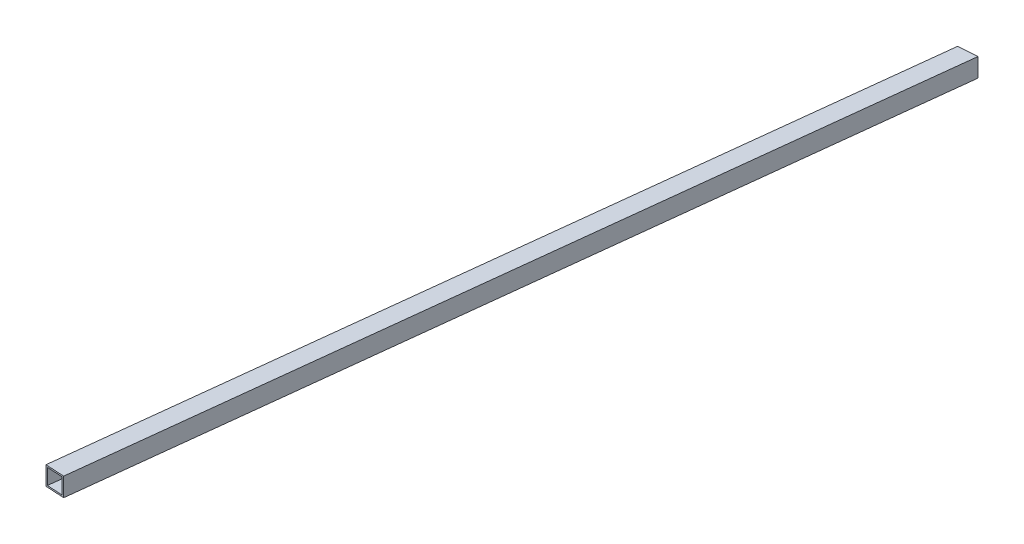
ISO-10303-21;
HEADER;
FILE_DESCRIPTION(('STEP AP214'),'2;1');
FILE_NAME('part.step','',(''),(''),'','','');
FILE_SCHEMA(('AUTOMOTIVE_DESIGN { 1 0 10303 214 1 1 1 1 }'));
ENDSEC;
DATA;
#1=APPLICATION_CONTEXT('core data for automotive mechanical design processes');
#2=APPLICATION_PROTOCOL_DEFINITION('international standard','automotive_design',2000,#1);
#3=PRODUCT_CONTEXT('',#1,'mechanical');
#4=PRODUCT('Part','Part','',(#3));
#5=PRODUCT_RELATED_PRODUCT_CATEGORY('part','',(#4));
#6=PRODUCT_DEFINITION_FORMATION('','',#4);
#7=PRODUCT_DEFINITION_CONTEXT('part definition',#1,'design');
#8=PRODUCT_DEFINITION('design','',#6,#7);
#9=PRODUCT_DEFINITION_SHAPE('','',#8);
#10=(LENGTH_UNIT() NAMED_UNIT(*) SI_UNIT(.MILLI.,.METRE.));
#11=(NAMED_UNIT(*) PLANE_ANGLE_UNIT() SI_UNIT($,.RADIAN.));
#12=(NAMED_UNIT(*) SI_UNIT($,.STERADIAN.) SOLID_ANGLE_UNIT());
#13=UNCERTAINTY_MEASURE_WITH_UNIT(LENGTH_MEASURE(1.E-05),#10,'distance_accuracy_value','');
#14=(GEOMETRIC_REPRESENTATION_CONTEXT(3) GLOBAL_UNCERTAINTY_ASSIGNED_CONTEXT((#13)) GLOBAL_UNIT_ASSIGNED_CONTEXT((#10,
#11,#12)) REPRESENTATION_CONTEXT('',''));
#15=CARTESIAN_POINT('',(0.,0.,0.));
#16=DIRECTION('',(0.,0.,1.));
#17=DIRECTION('',(1.,0.,0.));
#18=AXIS2_PLACEMENT_3D('',#15,#16,#17);
#19=CARTESIAN_POINT('',(259.935326726564,10.,-1698.86453408839));
#20=DIRECTION('',(0.,-1.,0.));
#21=DIRECTION('',(0.,0.,-1.));
#22=AXIS2_PLACEMENT_3D('',#19,#20,#21);
#23=PLANE('',#22);
#24=DIRECTION('',(-0.998381858973911,0.,-0.0568653116741473));
#25=VECTOR('',#24,1.);
#26=CARTESIAN_POINT('',(209.967663363282,10.,-821.584393198983));
#27=LINE('',#26,#25);
#28=CARTESIAN_POINT('',(160.,10.,-824.430425230958));
#29=VERTEX_POINT('',#28);
#30=CARTESIAN_POINT('',(140.,10.,-825.569574769043));
#31=VERTEX_POINT('',#30);
#32=EDGE_CURVE('E118',#29,#31,#27,.T.);
#33=ORIENTED_EDGE('',*,*,#32,.F.);
#34=DIRECTION('',(-0.113546591160732,0.,0.993532672656404));
#35=VECTOR('',#34,1.);
#36=CARTESIAN_POINT('',(259.935326726564,10.,-1698.86453408839));
#37=LINE('',#36,#35);
#38=CARTESIAN_POINT('',(260.141225962762,10.,-1700.66615240513));
#39=VERTEX_POINT('',#38);
#40=EDGE_CURVE('E55',#39,#29,#37,.T.);
#41=ORIENTED_EDGE('',*,*,#40,.F.);
#42=DIRECTION('',(0.997849528858152,0.,-0.0655463023942971));
#43=VECTOR('',#42,1.);
#44=CARTESIAN_POINT('',(259.818375864009,10.,-1700.64494516938));
#45=LINE('',#44,#43);
#46=CARTESIAN_POINT('',(239.858774037238,10.,-1699.33384759487));
#47=VERTEX_POINT('',#46);
#48=EDGE_CURVE('E130',#47,#39,#45,.T.);
#49=ORIENTED_EDGE('',*,*,#48,.F.);
#50=DIRECTION('',(-0.113546591160732,0.,0.993532672656404));
#51=VECTOR('',#50,1.);
#52=CARTESIAN_POINT('',(240.064673273436,10.,-1701.13546591161));
#53=LINE('',#52,#51);
#54=EDGE_CURVE('E137',#47,#31,#53,.T.);
#55=ORIENTED_EDGE('',*,*,#54,.T.);
#56=EDGE_LOOP('',(#33,#41,#49,#55));
#57=FACE_BOUND('',#56,.T.);
#58=ADVANCED_FACE('F41',(#57),#23,.F.);
#59=CARTESIAN_POINT('',(259.935326726564,10.,-1698.86453408839));
#60=DIRECTION('',(-0.993532672656404,0.,-0.113546591160732));
#61=DIRECTION('',(-0.113546591160732,0.,0.993532672656404));
#62=AXIS2_PLACEMENT_3D('',#59,#60,#61);
#63=PLANE('',#62);
#64=DIRECTION('',(0.,1.,0.));
#65=VECTOR('',#64,1.);
#66=CARTESIAN_POINT('',(160.,10.,-824.430425230957));
#67=LINE('',#66,#65);
#68=CARTESIAN_POINT('',(160.,-10.,-824.430425230957));
#69=VERTEX_POINT('',#68);
#70=EDGE_CURVE('E160',#69,#29,#67,.T.);
#71=ORIENTED_EDGE('',*,*,#70,.F.);
#72=DIRECTION('',(-0.113546591160732,0.,0.993532672656404));
#73=VECTOR('',#72,1.);
#74=CARTESIAN_POINT('',(259.935326726564,-10.,-1698.86453408839));
#75=LINE('',#74,#73);
#76=CARTESIAN_POINT('',(260.141225962762,-10.,-1700.66615240513));
#77=VERTEX_POINT('',#76);
#78=EDGE_CURVE('E127',#77,#69,#75,.T.);
#79=ORIENTED_EDGE('',*,*,#78,.F.);
#80=DIRECTION('',(0.,-1.,0.));
#81=VECTOR('',#80,1.);
#82=CARTESIAN_POINT('',(260.141225962762,10.,-1700.66615240513));
#83=LINE('',#82,#81);
#84=EDGE_CURVE('E175',#39,#77,#83,.T.);
#85=ORIENTED_EDGE('',*,*,#84,.F.);
#86=ORIENTED_EDGE('',*,*,#40,.T.);
#87=EDGE_LOOP('',(#71,#79,#85,#86));
#88=FACE_BOUND('',#87,.T.);
#89=ADVANCED_FACE('F183',(#88),#63,.F.);
#90=CARTESIAN_POINT('',(259.935326726564,-10.,-1698.86453408839));
#91=DIRECTION('',(0.,1.,0.));
#92=DIRECTION('',(0.,0.,1.));
#93=AXIS2_PLACEMENT_3D('',#90,#91,#92);
#94=PLANE('',#93);
#95=DIRECTION('',(0.998381858973911,0.,0.0568653116741473));
#96=VECTOR('',#95,1.);
#97=CARTESIAN_POINT('',(209.967663363282,-10.,-821.584393198983));
#98=LINE('',#97,#96);
#99=CARTESIAN_POINT('',(140.,-10.,-825.569574769043));
#100=VERTEX_POINT('',#99);
#101=EDGE_CURVE('E163',#100,#69,#98,.T.);
#102=ORIENTED_EDGE('',*,*,#101,.F.);
#103=DIRECTION('',(-0.113546591160732,0.,0.993532672656404));
#104=VECTOR('',#103,1.);
#105=CARTESIAN_POINT('',(240.064673273436,-10.,-1701.13546591161));
#106=LINE('',#105,#104);
#107=CARTESIAN_POINT('',(239.858774037238,-10.,-1699.33384759487));
#108=VERTEX_POINT('',#107);
#109=EDGE_CURVE('E139',#108,#100,#106,.T.);
#110=ORIENTED_EDGE('',*,*,#109,.F.);
#111=DIRECTION('',(-0.997849528858152,0.,0.0655463023942971));
#112=VECTOR('',#111,1.);
#113=CARTESIAN_POINT('',(259.818375864009,-10.,-1700.64494516938));
#114=LINE('',#113,#112);
#115=EDGE_CURVE('E173',#77,#108,#114,.T.);
#116=ORIENTED_EDGE('',*,*,#115,.F.);
#117=ORIENTED_EDGE('',*,*,#78,.T.);
#118=EDGE_LOOP('',(#102,#110,#116,#117));
#119=FACE_BOUND('',#118,.T.);
#120=ADVANCED_FACE('F185',(#119),#94,.F.);
#121=CARTESIAN_POINT('',(240.064673273436,10.,-1701.13546591161));
#122=DIRECTION('',(0.993532672656404,0.,0.113546591160732));
#123=DIRECTION('',(0.113546591160732,0.,-0.993532672656404));
#124=AXIS2_PLACEMENT_3D('',#121,#122,#123);
#125=PLANE('',#124);
#126=DIRECTION('',(0.,-1.,0.));
#127=VECTOR('',#126,1.);
#128=CARTESIAN_POINT('',(140.,10.,-825.569574769043));
#129=LINE('',#128,#127);
#130=EDGE_CURVE('E152',#31,#100,#129,.T.);
#131=ORIENTED_EDGE('',*,*,#130,.F.);
#132=ORIENTED_EDGE('',*,*,#54,.F.);
#133=DIRECTION('',(0.,1.,0.));
#134=VECTOR('',#133,1.);
#135=CARTESIAN_POINT('',(239.858774037238,10.,-1699.33384759487));
#136=LINE('',#135,#134);
#137=EDGE_CURVE('E170',#108,#47,#136,.T.);
#138=ORIENTED_EDGE('',*,*,#137,.F.);
#139=ORIENTED_EDGE('',*,*,#109,.T.);
#140=EDGE_LOOP('',(#131,#132,#138,#139));
#141=FACE_BOUND('',#140,.T.);
#142=ADVANCED_FACE('F187',(#141),#125,.F.);
#143=CARTESIAN_POINT('',(250.,0.,-1700.));
#144=DIRECTION('',(-0.0655463023942971,0.,-0.997849528858152));
#145=DIRECTION('',(-0.997849528858152,0.,0.0655463023942971));
#146=AXIS2_PLACEMENT_3D('',#143,#144,#145);
#147=PLANE('',#146);
#148=DIRECTION('',(0.,1.,0.));
#149=VECTOR('',#148,1.);
#150=CARTESIAN_POINT('',(241.48137019128,8.40000000000002,-1699.44043197969));
#151=LINE('',#150,#149);
#152=CARTESIAN_POINT('',(241.48137019128,-8.39999999999999,-1699.44043197969));
#153=VERTEX_POINT('',#152);
#154=CARTESIAN_POINT('',(241.48137019128,8.40000000000002,-1699.44043197969));
#155=VERTEX_POINT('',#154);
#156=EDGE_CURVE('E123',#153,#155,#151,.T.);
#157=ORIENTED_EDGE('',*,*,#156,.F.);
#158=DIRECTION('',(-0.997849528858152,0.,0.0655463023942971));
#159=VECTOR('',#158,1.);
#160=CARTESIAN_POINT('',(258.247435725767,-8.39999999999999,-1700.54175394228));
#161=LINE('',#160,#159);
#162=CARTESIAN_POINT('',(258.51862980872,-8.39999999999999,-1700.55956802031));
#163=VERTEX_POINT('',#162);
#164=EDGE_CURVE('E149',#163,#153,#161,.T.);
#165=ORIENTED_EDGE('',*,*,#164,.F.);
#166=DIRECTION('',(0.,-1.,0.));
#167=VECTOR('',#166,1.);
#168=CARTESIAN_POINT('',(258.51862980872,8.39999999999999,-1700.55956802031));
#169=LINE('',#168,#167);
#170=CARTESIAN_POINT('',(258.51862980872,8.39999999999999,-1700.55956802031));
#171=VERTEX_POINT('',#170);
#172=EDGE_CURVE('E147',#171,#163,#169,.T.);
#173=ORIENTED_EDGE('',*,*,#172,.F.);
#174=DIRECTION('',(0.997849528858152,0.,-0.0655463023942971));
#175=VECTOR('',#174,1.);
#176=CARTESIAN_POINT('',(258.247435725767,8.39999999999999,-1700.54175394228));
#177=LINE('',#176,#175);
#178=EDGE_CURVE('E48',#155,#171,#177,.T.);
#179=ORIENTED_EDGE('',*,*,#178,.F.);
#180=EDGE_LOOP('',(#157,#165,#173,#179));
#181=FACE_BOUND('',#180,.T.);
#182=ORIENTED_EDGE('',*,*,#137,.T.);
#183=ORIENTED_EDGE('',*,*,#48,.T.);
#184=ORIENTED_EDGE('',*,*,#84,.T.);
#185=ORIENTED_EDGE('',*,*,#115,.T.);
#186=EDGE_LOOP('',(#182,#183,#184,#185));
#187=FACE_BOUND('',#186,.T.);
#188=ADVANCED_FACE('F144',(#181,#187),#147,.T.);
#189=CARTESIAN_POINT('',(241.654325549686,8.40000000000002,-1700.95379136575));
#190=DIRECTION('',(0.993532672656404,0.,0.113546591160732));
#191=DIRECTION('',(0.113546591160732,0.,-0.993532672656404));
#192=AXIS2_PLACEMENT_3D('',#189,#190,#191);
#193=PLANE('',#192);
#194=DIRECTION('',(-0.113546591160732,0.,0.993532672656404));
#195=VECTOR('',#194,1.);
#196=CARTESIAN_POINT('',(241.654325549686,8.40000000000002,-1700.95379136575));
#197=LINE('',#196,#195);
#198=CARTESIAN_POINT('',(141.6,8.40000000000002,-825.478442805996));
#199=VERTEX_POINT('',#198);
#200=EDGE_CURVE('E114',#155,#199,#197,.T.);
#201=ORIENTED_EDGE('',*,*,#200,.T.);
#202=DIRECTION('',(0.,-1.,0.));
#203=VECTOR('',#202,1.);
#204=CARTESIAN_POINT('',(141.6,8.40000000000002,-825.478442805996));
#205=LINE('',#204,#203);
#206=CARTESIAN_POINT('',(141.6,-8.39999999999999,-825.478442805996));
#207=VERTEX_POINT('',#206);
#208=EDGE_CURVE('E11',#199,#207,#205,.T.);
#209=ORIENTED_EDGE('',*,*,#208,.T.);
#210=DIRECTION('',(-0.113546591160732,0.,0.993532672656404));
#211=VECTOR('',#210,1.);
#212=CARTESIAN_POINT('',(241.654325549686,-8.39999999999999,-1700.95379136575));
#213=LINE('',#212,#211);
#214=EDGE_CURVE('E135',#153,#207,#213,.T.);
#215=ORIENTED_EDGE('',*,*,#214,.F.);
#216=ORIENTED_EDGE('',*,*,#156,.T.);
#217=EDGE_LOOP('',(#201,#209,#215,#216));
#218=FACE_BOUND('',#217,.T.);
#219=ADVANCED_FACE('F122',(#218),#193,.T.);
#220=CARTESIAN_POINT('',(258.345674450314,-8.39999999999999,-1699.04620863425));
#221=DIRECTION('',(0.,1.,0.));
#222=DIRECTION('',(0.,0.,1.));
#223=AXIS2_PLACEMENT_3D('',#220,#221,#222);
#224=PLANE('',#223);
#225=ORIENTED_EDGE('',*,*,#214,.T.);
#226=DIRECTION('',(0.998381858973911,0.,0.0568653116741473));
#227=VECTOR('',#226,1.);
#228=CARTESIAN_POINT('',(208.372837225157,-8.39999999999999,-821.675230471912));
#229=LINE('',#228,#227);
#230=CARTESIAN_POINT('',(158.4,-8.39999999999999,-824.521557194004));
#231=VERTEX_POINT('',#230);
#232=EDGE_CURVE('E63',#207,#231,#229,.T.);
#233=ORIENTED_EDGE('',*,*,#232,.T.);
#234=DIRECTION('',(-0.113546591160732,0.,0.993532672656404));
#235=VECTOR('',#234,1.);
#236=CARTESIAN_POINT('',(258.345674450314,-8.39999999999999,-1699.04620863425));
#237=LINE('',#236,#235);
#238=EDGE_CURVE('E125',#163,#231,#237,.T.);
#239=ORIENTED_EDGE('',*,*,#238,.F.);
#240=ORIENTED_EDGE('',*,*,#164,.T.);
#241=EDGE_LOOP('',(#225,#233,#239,#240));
#242=FACE_BOUND('',#241,.T.);
#243=ADVANCED_FACE('F226',(#242),#224,.T.);
#244=CARTESIAN_POINT('',(258.345674450314,8.39999999999999,-1699.04620863425));
#245=DIRECTION('',(-0.993532672656404,0.,-0.113546591160732));
#246=DIRECTION('',(-0.113546591160732,0.,0.993532672656404));
#247=AXIS2_PLACEMENT_3D('',#244,#245,#246);
#248=PLANE('',#247);
#249=ORIENTED_EDGE('',*,*,#238,.T.);
#250=DIRECTION('',(0.,1.,0.));
#251=VECTOR('',#250,1.);
#252=CARTESIAN_POINT('',(158.4,8.39999999999999,-824.521557194004));
#253=LINE('',#252,#251);
#254=CARTESIAN_POINT('',(158.4,8.39999999999999,-824.521557194004));
#255=VERTEX_POINT('',#254);
#256=EDGE_CURVE('E119',#231,#255,#253,.T.);
#257=ORIENTED_EDGE('',*,*,#256,.T.);
#258=DIRECTION('',(-0.113546591160732,0.,0.993532672656404));
#259=VECTOR('',#258,1.);
#260=CARTESIAN_POINT('',(258.345674450314,8.39999999999999,-1699.04620863425));
#261=LINE('',#260,#259);
#262=EDGE_CURVE('E116',#171,#255,#261,.T.);
#263=ORIENTED_EDGE('',*,*,#262,.F.);
#264=ORIENTED_EDGE('',*,*,#172,.T.);
#265=EDGE_LOOP('',(#249,#257,#263,#264));
#266=FACE_BOUND('',#265,.T.);
#267=ADVANCED_FACE('F154',(#266),#248,.T.);
#268=CARTESIAN_POINT('',(258.345674450314,8.39999999999999,-1699.04620863425));
#269=DIRECTION('',(0.,-1.,0.));
#270=DIRECTION('',(1.,0.,0.));
#271=AXIS2_PLACEMENT_3D('',#268,#269,#270);
#272=PLANE('',#271);
#273=ORIENTED_EDGE('',*,*,#262,.T.);
#274=DIRECTION('',(-0.998381858973911,0.,-0.0568653116741473));
#275=VECTOR('',#274,1.);
#276=CARTESIAN_POINT('',(208.372837225157,8.39999999999991,-821.675230471912));
#277=LINE('',#276,#275);
#278=EDGE_CURVE('E105',#255,#199,#277,.T.);
#279=ORIENTED_EDGE('',*,*,#278,.T.);
#280=ORIENTED_EDGE('',*,*,#200,.F.);
#281=ORIENTED_EDGE('',*,*,#178,.T.);
#282=EDGE_LOOP('',(#273,#279,#280,#281));
#283=FACE_BOUND('',#282,.T.);
#284=ADVANCED_FACE('F112',(#283),#272,.T.);
#285=CARTESIAN_POINT('',(150.,0.,-825.));
#286=DIRECTION('',(-0.0568653116741473,0.,0.998381858973911));
#287=DIRECTION('',(0.998381858973911,0.,0.0568653116741473));
#288=AXIS2_PLACEMENT_3D('',#285,#286,#287);
#289=PLANE('',#288);
#290=ORIENTED_EDGE('',*,*,#278,.F.);
#291=ORIENTED_EDGE('',*,*,#256,.F.);
#292=ORIENTED_EDGE('',*,*,#232,.F.);
#293=ORIENTED_EDGE('',*,*,#208,.F.);
#294=EDGE_LOOP('',(#290,#291,#292,#293));
#295=FACE_BOUND('',#294,.T.);
#296=ORIENTED_EDGE('',*,*,#32,.T.);
#297=ORIENTED_EDGE('',*,*,#130,.T.);
#298=ORIENTED_EDGE('',*,*,#101,.T.);
#299=ORIENTED_EDGE('',*,*,#70,.T.);
#300=EDGE_LOOP('',(#296,#297,#298,#299));
#301=FACE_BOUND('',#300,.T.);
#302=ADVANCED_FACE('F103',(#295,#301),#289,.T.);
#303=CLOSED_SHELL('',(#58,#89,#120,#142,#188,#219,#243,#267,#284,#302));
#304=MANIFOLD_SOLID_BREP('B2',#303);
#305=ADVANCED_BREP_SHAPE_REPRESENTATION('',(#18,#304),#14);
#306=SHAPE_DEFINITION_REPRESENTATION(#9,#305);
ENDSEC;
END-ISO-10303-21;
